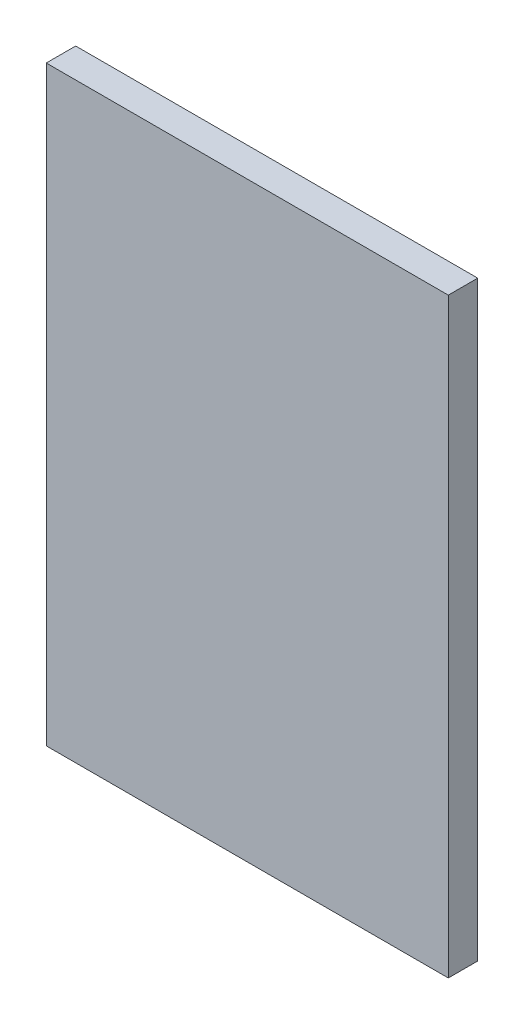
ISO-10303-21;
HEADER;
FILE_DESCRIPTION(('STEP AP214'),'2;1');
FILE_NAME('part.step','',(''),(''),'','','');
FILE_SCHEMA(('AUTOMOTIVE_DESIGN { 1 0 10303 214 1 1 1 1 }'));
ENDSEC;
DATA;
#1=APPLICATION_CONTEXT('core data for automotive mechanical design processes');
#2=APPLICATION_PROTOCOL_DEFINITION('international standard','automotive_design',2000,#1);
#3=PRODUCT_CONTEXT('',#1,'mechanical');
#4=PRODUCT('Part','Part','',(#3));
#5=PRODUCT_RELATED_PRODUCT_CATEGORY('part','',(#4));
#6=PRODUCT_DEFINITION_FORMATION('','',#4);
#7=PRODUCT_DEFINITION_CONTEXT('part definition',#1,'design');
#8=PRODUCT_DEFINITION('design','',#6,#7);
#9=PRODUCT_DEFINITION_SHAPE('','',#8);
#10=(LENGTH_UNIT() NAMED_UNIT(*) SI_UNIT(.MILLI.,.METRE.));
#11=(NAMED_UNIT(*) PLANE_ANGLE_UNIT() SI_UNIT($,.RADIAN.));
#12=(NAMED_UNIT(*) SI_UNIT($,.STERADIAN.) SOLID_ANGLE_UNIT());
#13=UNCERTAINTY_MEASURE_WITH_UNIT(LENGTH_MEASURE(1.E-05),#10,'distance_accuracy_value','');
#14=(GEOMETRIC_REPRESENTATION_CONTEXT(3) GLOBAL_UNCERTAINTY_ASSIGNED_CONTEXT((#13)) GLOBAL_UNIT_ASSIGNED_CONTEXT((#10,
#11,#12)) REPRESENTATION_CONTEXT('',''));
#15=CARTESIAN_POINT('',(0.,0.,0.));
#16=DIRECTION('',(0.,0.,1.));
#17=DIRECTION('',(1.,0.,0.));
#18=AXIS2_PLACEMENT_3D('',#15,#16,#17);
#19=CARTESIAN_POINT('',(34.6931083487988,-51.0305831944936,5.08));
#20=DIRECTION('',(-1.,0.,0.));
#21=DIRECTION('',(0.,0.,1.));
#22=AXIS2_PLACEMENT_3D('',#19,#20,#21);
#23=PLANE('',#22);
#24=DIRECTION('',(0.,1.,0.));
#25=VECTOR('',#24,1.);
#26=CARTESIAN_POINT('',(34.6931083487988,-51.0305831944936,0.));
#27=LINE('',#26,#25);
#28=CARTESIAN_POINT('',(34.6931083487988,-51.0305831944936,0.));
#29=VERTEX_POINT('',#28);
#30=CARTESIAN_POINT('',(34.6931083487988,51.0305831944936,0.));
#31=VERTEX_POINT('',#30);
#32=EDGE_CURVE('E95',#29,#31,#27,.T.);
#33=ORIENTED_EDGE('',*,*,#32,.T.);
#34=DIRECTION('',(0.,0.,-1.));
#35=VECTOR('',#34,1.);
#36=CARTESIAN_POINT('',(34.6931083487988,51.0305831944936,5.08));
#37=LINE('',#36,#35);
#38=CARTESIAN_POINT('',(34.6931083487988,51.0305831944936,5.08));
#39=VERTEX_POINT('',#38);
#40=EDGE_CURVE('E11',#39,#31,#37,.T.);
#41=ORIENTED_EDGE('',*,*,#40,.F.);
#42=DIRECTION('',(0.,1.,0.));
#43=VECTOR('',#42,1.);
#44=CARTESIAN_POINT('',(34.6931083487988,-51.0305831944936,5.08));
#45=LINE('',#44,#43);
#46=CARTESIAN_POINT('',(34.6931083487988,-51.0305831944936,5.08));
#47=VERTEX_POINT('',#46);
#48=EDGE_CURVE('E83',#47,#39,#45,.T.);
#49=ORIENTED_EDGE('',*,*,#48,.F.);
#50=DIRECTION('',(0.,0.,-1.));
#51=VECTOR('',#50,1.);
#52=CARTESIAN_POINT('',(34.6931083487988,-51.0305831944936,5.08));
#53=LINE('',#52,#51);
#54=EDGE_CURVE('E91',#47,#29,#53,.T.);
#55=ORIENTED_EDGE('',*,*,#54,.T.);
#56=EDGE_LOOP('',(#33,#41,#49,#55));
#57=FACE_BOUND('',#56,.T.);
#58=ADVANCED_FACE('F32',(#57),#23,.F.);
#59=CARTESIAN_POINT('',(-34.6931083487988,51.0305831944936,5.08));
#60=DIRECTION('',(0.,-1.,0.));
#61=DIRECTION('',(0.,0.,-1.));
#62=AXIS2_PLACEMENT_3D('',#59,#60,#61);
#63=PLANE('',#62);
#64=DIRECTION('',(-1.,0.,0.));
#65=VECTOR('',#64,1.);
#66=CARTESIAN_POINT('',(-34.6931083487988,51.0305831944936,0.));
#67=LINE('',#66,#65);
#68=CARTESIAN_POINT('',(-34.6931083487988,51.0305831944936,0.));
#69=VERTEX_POINT('',#68);
#70=EDGE_CURVE('E87',#31,#69,#67,.T.);
#71=ORIENTED_EDGE('',*,*,#70,.T.);
#72=DIRECTION('',(0.,0.,-1.));
#73=VECTOR('',#72,1.);
#74=CARTESIAN_POINT('',(-34.6931083487988,51.0305831944936,5.08));
#75=LINE('',#74,#73);
#76=CARTESIAN_POINT('',(-34.6931083487988,51.0305831944936,5.08));
#77=VERTEX_POINT('',#76);
#78=EDGE_CURVE('E40',#77,#69,#75,.T.);
#79=ORIENTED_EDGE('',*,*,#78,.F.);
#80=DIRECTION('',(-1.,0.,0.));
#81=VECTOR('',#80,1.);
#82=CARTESIAN_POINT('',(-34.6931083487988,51.0305831944936,5.08));
#83=LINE('',#82,#81);
#84=EDGE_CURVE('E78',#39,#77,#83,.T.);
#85=ORIENTED_EDGE('',*,*,#84,.F.);
#86=ORIENTED_EDGE('',*,*,#40,.T.);
#87=EDGE_LOOP('',(#71,#79,#85,#86));
#88=FACE_BOUND('',#87,.T.);
#89=ADVANCED_FACE('F86',(#88),#63,.F.);
#90=CARTESIAN_POINT('',(-34.6931083487988,-51.0305831944936,5.08));
#91=DIRECTION('',(1.,0.,0.));
#92=DIRECTION('',(0.,0.,-1.));
#93=AXIS2_PLACEMENT_3D('',#90,#91,#92);
#94=PLANE('',#93);
#95=DIRECTION('',(0.,-1.,0.));
#96=VECTOR('',#95,1.);
#97=CARTESIAN_POINT('',(-34.6931083487988,-51.0305831944936,0.));
#98=LINE('',#97,#96);
#99=CARTESIAN_POINT('',(-34.6931083487988,-51.0305831944936,0.));
#100=VERTEX_POINT('',#99);
#101=EDGE_CURVE('E65',#69,#100,#98,.T.);
#102=ORIENTED_EDGE('',*,*,#101,.T.);
#103=DIRECTION('',(0.,0.,-1.));
#104=VECTOR('',#103,1.);
#105=CARTESIAN_POINT('',(-34.6931083487988,-51.0305831944936,5.08));
#106=LINE('',#105,#104);
#107=CARTESIAN_POINT('',(-34.6931083487988,-51.0305831944936,5.08));
#108=VERTEX_POINT('',#107);
#109=EDGE_CURVE('E88',#108,#100,#106,.T.);
#110=ORIENTED_EDGE('',*,*,#109,.F.);
#111=DIRECTION('',(0.,-1.,0.));
#112=VECTOR('',#111,1.);
#113=CARTESIAN_POINT('',(-34.6931083487988,-51.0305831944936,5.08));
#114=LINE('',#113,#112);
#115=EDGE_CURVE('E81',#77,#108,#114,.T.);
#116=ORIENTED_EDGE('',*,*,#115,.F.);
#117=ORIENTED_EDGE('',*,*,#78,.T.);
#118=EDGE_LOOP('',(#102,#110,#116,#117));
#119=FACE_BOUND('',#118,.T.);
#120=ADVANCED_FACE('F89',(#119),#94,.F.);
#121=CARTESIAN_POINT('',(-34.6931083487988,-51.0305831944936,5.08));
#122=DIRECTION('',(0.,1.,0.));
#123=DIRECTION('',(0.,0.,1.));
#124=AXIS2_PLACEMENT_3D('',#121,#122,#123);
#125=PLANE('',#124);
#126=DIRECTION('',(1.,0.,0.));
#127=VECTOR('',#126,1.);
#128=CARTESIAN_POINT('',(-34.6931083487988,-51.0305831944936,0.));
#129=LINE('',#128,#127);
#130=EDGE_CURVE('E71',#100,#29,#129,.T.);
#131=ORIENTED_EDGE('',*,*,#130,.T.);
#132=ORIENTED_EDGE('',*,*,#54,.F.);
#133=DIRECTION('',(1.,0.,0.));
#134=VECTOR('',#133,1.);
#135=CARTESIAN_POINT('',(-34.6931083487988,-51.0305831944936,5.08));
#136=LINE('',#135,#134);
#137=EDGE_CURVE('E48',#108,#47,#136,.T.);
#138=ORIENTED_EDGE('',*,*,#137,.F.);
#139=ORIENTED_EDGE('',*,*,#109,.T.);
#140=EDGE_LOOP('',(#131,#132,#138,#139));
#141=FACE_BOUND('',#140,.T.);
#142=ADVANCED_FACE('F102',(#141),#125,.F.);
#143=CARTESIAN_POINT('',(34.6931083487988,51.0305831944936,5.08));
#144=DIRECTION('',(0.,0.,-1.));
#145=DIRECTION('',(-1.,0.,0.));
#146=AXIS2_PLACEMENT_3D('',#143,#144,#145);
#147=PLANE('',#146);
#148=ORIENTED_EDGE('',*,*,#48,.T.);
#149=ORIENTED_EDGE('',*,*,#84,.T.);
#150=ORIENTED_EDGE('',*,*,#115,.T.);
#151=ORIENTED_EDGE('',*,*,#137,.T.);
#152=EDGE_LOOP('',(#148,#149,#150,#151));
#153=FACE_BOUND('',#152,.T.);
#154=ADVANCED_FACE('F79',(#153),#147,.F.);
#155=CARTESIAN_POINT('',(34.6931083487988,51.0305831944936,0.));
#156=DIRECTION('',(0.,0.,-1.));
#157=DIRECTION('',(-1.,0.,0.));
#158=AXIS2_PLACEMENT_3D('',#155,#156,#157);
#159=PLANE('',#158);
#160=ORIENTED_EDGE('',*,*,#32,.F.);
#161=ORIENTED_EDGE('',*,*,#130,.F.);
#162=ORIENTED_EDGE('',*,*,#101,.F.);
#163=ORIENTED_EDGE('',*,*,#70,.F.);
#164=EDGE_LOOP('',(#160,#161,#162,#163));
#165=FACE_BOUND('',#164,.T.);
#166=ADVANCED_FACE('F105',(#165),#159,.T.);
#167=CLOSED_SHELL('',(#58,#89,#120,#142,#154,#166));
#168=MANIFOLD_SOLID_BREP('B2',#167);
#169=ADVANCED_BREP_SHAPE_REPRESENTATION('',(#18,#168),#14);
#170=SHAPE_DEFINITION_REPRESENTATION(#9,#169);
ENDSEC;
END-ISO-10303-21;
